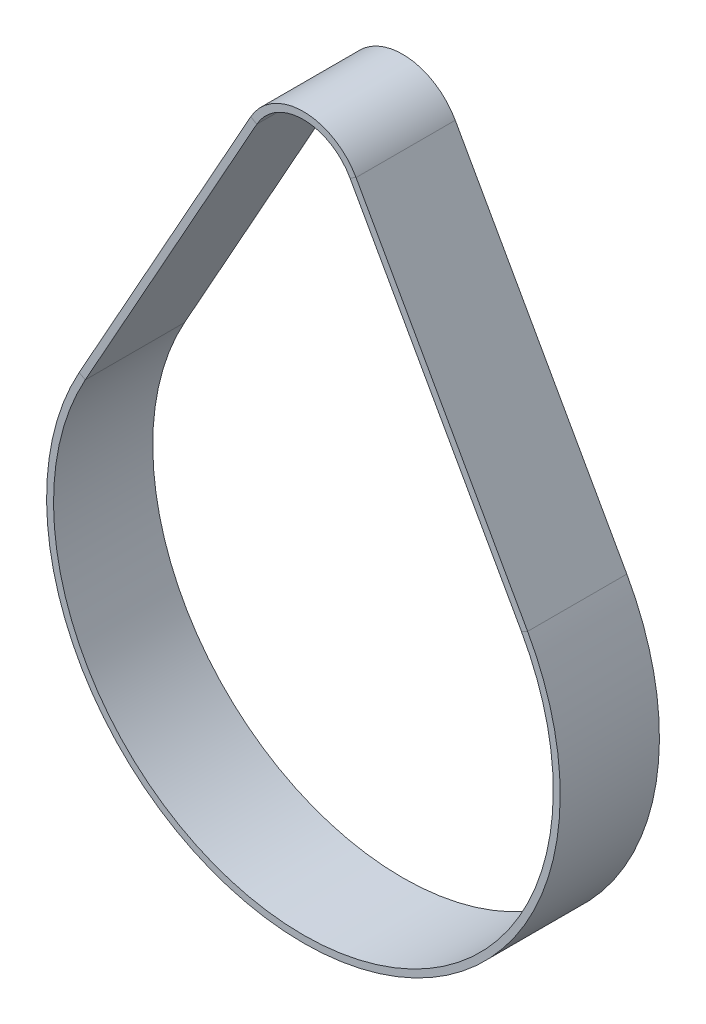
ISO-10303-21;
HEADER;
FILE_DESCRIPTION(('STEP AP214'),'2;1');
FILE_NAME('part.step','',(''),(''),'','','');
FILE_SCHEMA(('AUTOMOTIVE_DESIGN { 1 0 10303 214 1 1 1 1 }'));
ENDSEC;
DATA;
#1=APPLICATION_CONTEXT('core data for automotive mechanical design processes');
#2=APPLICATION_PROTOCOL_DEFINITION('international standard','automotive_design',2000,#1);
#3=PRODUCT_CONTEXT('',#1,'mechanical');
#4=PRODUCT('Part','Part','',(#3));
#5=PRODUCT_RELATED_PRODUCT_CATEGORY('part','',(#4));
#6=PRODUCT_DEFINITION_FORMATION('','',#4);
#7=PRODUCT_DEFINITION_CONTEXT('part definition',#1,'design');
#8=PRODUCT_DEFINITION('design','',#6,#7);
#9=PRODUCT_DEFINITION_SHAPE('','',#8);
#10=(LENGTH_UNIT() NAMED_UNIT(*) SI_UNIT(.MILLI.,.METRE.));
#11=(NAMED_UNIT(*) PLANE_ANGLE_UNIT() SI_UNIT($,.RADIAN.));
#12=(NAMED_UNIT(*) SI_UNIT($,.STERADIAN.) SOLID_ANGLE_UNIT());
#13=UNCERTAINTY_MEASURE_WITH_UNIT(LENGTH_MEASURE(1.E-05),#10,'distance_accuracy_value','');
#14=(GEOMETRIC_REPRESENTATION_CONTEXT(3) GLOBAL_UNCERTAINTY_ASSIGNED_CONTEXT((#13)) GLOBAL_UNIT_ASSIGNED_CONTEXT((#10,
#11,#12)) REPRESENTATION_CONTEXT('',''));
#15=CARTESIAN_POINT('',(0.,0.,0.));
#16=DIRECTION('',(0.,0.,1.));
#17=DIRECTION('',(1.,0.,0.));
#18=AXIS2_PLACEMENT_3D('',#15,#16,#17);
#19=CARTESIAN_POINT('',(0.,0.,0.));
#20=DIRECTION('',(0.,0.,1.));
#21=DIRECTION('',(1.,0.,0.));
#22=AXIS2_PLACEMENT_3D('',#19,#20,#21);
#23=CYLINDRICAL_SURFACE('',#22,22.66431181);
#24=DIRECTION('',(0.,0.,1.));
#25=VECTOR('',#24,1.);
#26=CARTESIAN_POINT('',(19.7879168947119,11.0503110720414,-4.5));
#27=LINE('',#26,#25);
#28=CARTESIAN_POINT('',(19.7879168947119,11.0503110720414,-4.5));
#29=VERTEX_POINT('',#28);
#30=CARTESIAN_POINT('',(19.7879168947119,11.0503110720414,4.5));
#31=VERTEX_POINT('',#30);
#32=EDGE_CURVE('E135',#29,#31,#27,.T.);
#33=ORIENTED_EDGE('',*,*,#32,.F.);
#34=CARTESIAN_POINT('',(0.,0.,-4.5));
#35=DIRECTION('',(0.,0.,1.));
#36=DIRECTION('',(-0.873087039244713,0.487564377188184,0.));
#37=AXIS2_PLACEMENT_3D('',#34,#35,#36);
#38=CIRCLE('',#37,22.66431181);
#39=CARTESIAN_POINT('',(-19.7879168947119,11.0503110720415,-4.5));
#40=VERTEX_POINT('',#39);
#41=EDGE_CURVE('E11',#40,#29,#38,.T.);
#42=ORIENTED_EDGE('',*,*,#41,.F.);
#43=DIRECTION('',(0.,0.,1.));
#44=VECTOR('',#43,1.);
#45=CARTESIAN_POINT('',(-19.7879168947119,11.0503110720414,-4.5));
#46=LINE('',#45,#44);
#47=CARTESIAN_POINT('',(-19.7879168947119,11.0503110720415,4.5));
#48=VERTEX_POINT('',#47);
#49=EDGE_CURVE('E46',#40,#48,#46,.T.);
#50=ORIENTED_EDGE('',*,*,#49,.T.);
#51=CARTESIAN_POINT('',(0.,0.,4.5));
#52=DIRECTION('',(0.,0.,1.));
#53=DIRECTION('',(-0.873087039244713,0.487564377188184,0.));
#54=AXIS2_PLACEMENT_3D('',#51,#52,#53);
#55=CIRCLE('',#54,22.66431181);
#56=EDGE_CURVE('E132',#48,#31,#55,.T.);
#57=ORIENTED_EDGE('',*,*,#56,.T.);
#58=EDGE_LOOP('',(#33,#42,#50,#57));
#59=FACE_BOUND('',#58,.T.);
#60=ADVANCED_FACE('F43',(#59),#23,.F.);
#61=CARTESIAN_POINT('',(-19.7879168947119,11.0503110720414,-4.5));
#62=DIRECTION('',(0.,0.,-1.));
#63=DIRECTION('',(-1.,0.,0.));
#64=AXIS2_PLACEMENT_3D('',#61,#62,#63);
#65=PLANE('',#64);
#66=DIRECTION('',(-0.873087039244713,-0.487564377188183,0.));
#67=VECTOR('',#66,1.);
#68=CARTESIAN_POINT('',(19.7879168947119,11.0503110720414,-4.5));
#69=LINE('',#68,#67);
#70=CARTESIAN_POINT('',(20.337961729436,11.35747662967,-4.5));
#71=VERTEX_POINT('',#70);
#72=EDGE_CURVE('E163',#71,#29,#69,.T.);
#73=ORIENTED_EDGE('',*,*,#72,.F.);
#74=CARTESIAN_POINT('',(0.,0.,-4.5));
#75=DIRECTION('',(0.,0.,1.));
#76=DIRECTION('',(-0.873087039244713,0.487564377188184,0.));
#77=AXIS2_PLACEMENT_3D('',#74,#75,#76);
#78=CIRCLE('',#77,23.29431181);
#79=CARTESIAN_POINT('',(-20.337961729436,11.35747662967,-4.5));
#80=VERTEX_POINT('',#79);
#81=EDGE_CURVE('E52',#80,#71,#78,.T.);
#82=ORIENTED_EDGE('',*,*,#81,.F.);
#83=DIRECTION('',(0.873087039244712,-0.487564377188185,0.));
#84=VECTOR('',#83,1.);
#85=CARTESIAN_POINT('',(-19.7879168947119,11.0503110720414,-4.5));
#86=LINE('',#85,#84);
#87=EDGE_CURVE('E223',#80,#40,#86,.T.);
#88=ORIENTED_EDGE('',*,*,#87,.T.);
#89=ORIENTED_EDGE('',*,*,#41,.T.);
#90=EDGE_LOOP('',(#73,#82,#88,#89));
#91=FACE_BOUND('',#90,.T.);
#92=ADVANCED_FACE('F258',(#91),#65,.T.);
#93=CARTESIAN_POINT('',(0.,0.,0.));
#94=DIRECTION('',(0.,0.,1.));
#95=DIRECTION('',(1.,0.,0.));
#96=AXIS2_PLACEMENT_3D('',#93,#94,#95);
#97=CYLINDRICAL_SURFACE('',#96,23.29431181);
#98=DIRECTION('',(0.,0.,-1.));
#99=VECTOR('',#98,1.);
#100=CARTESIAN_POINT('',(20.337961729436,11.35747662967,-4.5));
#101=LINE('',#100,#99);
#102=CARTESIAN_POINT('',(20.337961729436,11.35747662967,4.5));
#103=VERTEX_POINT('',#102);
#104=EDGE_CURVE('E168',#103,#71,#101,.T.);
#105=ORIENTED_EDGE('',*,*,#104,.F.);
#106=CARTESIAN_POINT('',(0.,0.,4.5));
#107=DIRECTION('',(0.,0.,1.));
#108=DIRECTION('',(-0.873087039244713,0.487564377188184,0.));
#109=AXIS2_PLACEMENT_3D('',#106,#107,#108);
#110=CIRCLE('',#109,23.29431181);
#111=CARTESIAN_POINT('',(-20.337961729436,11.35747662967,4.5));
#112=VERTEX_POINT('',#111);
#113=EDGE_CURVE('E142',#112,#103,#110,.T.);
#114=ORIENTED_EDGE('',*,*,#113,.F.);
#115=DIRECTION('',(0.,0.,-1.));
#116=VECTOR('',#115,1.);
#117=CARTESIAN_POINT('',(-20.337961729436,11.35747662967,-4.5));
#118=LINE('',#117,#116);
#119=EDGE_CURVE('E199',#112,#80,#118,.T.);
#120=ORIENTED_EDGE('',*,*,#119,.T.);
#121=ORIENTED_EDGE('',*,*,#81,.T.);
#122=EDGE_LOOP('',(#105,#114,#120,#121));
#123=FACE_BOUND('',#122,.T.);
#124=ADVANCED_FACE('F263',(#123),#97,.T.);
#125=CARTESIAN_POINT('',(-4.22483167040517,38.9193036312714,-4.5));
#126=DIRECTION('',(0.873087039244713,-0.487564377188184,0.));
#127=DIRECTION('',(0.487564377188184,0.873087039244713,0.));
#128=AXIS2_PLACEMENT_3D('',#125,#126,#127);
#129=PLANE('',#128);
#130=ORIENTED_EDGE('',*,*,#49,.F.);
#131=DIRECTION('',(-0.487564377188184,-0.873087039244713,0.));
#132=VECTOR('',#131,1.);
#133=CARTESIAN_POINT('',(-4.22483167040517,38.9193036312714,-4.5));
#134=LINE('',#133,#132);
#135=CARTESIAN_POINT('',(-4.22483167040518,38.9193036312714,-4.5));
#136=VERTEX_POINT('',#135);
#137=EDGE_CURVE('E88',#136,#40,#134,.T.);
#138=ORIENTED_EDGE('',*,*,#137,.F.);
#139=DIRECTION('',(0.,0.,1.));
#140=VECTOR('',#139,1.);
#141=CARTESIAN_POINT('',(-4.22483167040518,38.9193036312714,-4.5));
#142=LINE('',#141,#140);
#143=CARTESIAN_POINT('',(-4.22483167040518,38.9193036312714,4.5));
#144=VERTEX_POINT('',#143);
#145=EDGE_CURVE('E203',#136,#144,#142,.T.);
#146=ORIENTED_EDGE('',*,*,#145,.T.);
#147=DIRECTION('',(-0.487564377188184,-0.873087039244713,0.));
#148=VECTOR('',#147,1.);
#149=CARTESIAN_POINT('',(-4.22483167040517,38.9193036312714,4.5));
#150=LINE('',#149,#148);
#151=EDGE_CURVE('E196',#144,#48,#150,.T.);
#152=ORIENTED_EDGE('',*,*,#151,.T.);
#153=EDGE_LOOP('',(#130,#138,#146,#152));
#154=FACE_BOUND('',#153,.T.);
#155=ADVANCED_FACE('F247',(#154),#129,.T.);
#156=CARTESIAN_POINT('',(-4.22483167040517,38.9193036312714,-4.5));
#157=DIRECTION('',(0.,0.,-1.));
#158=DIRECTION('',(-1.,0.,0.));
#159=AXIS2_PLACEMENT_3D('',#156,#157,#158);
#160=PLANE('',#159);
#161=ORIENTED_EDGE('',*,*,#137,.T.);
#162=ORIENTED_EDGE('',*,*,#87,.F.);
#163=DIRECTION('',(-0.487564377188184,-0.873087039244713,0.));
#164=VECTOR('',#163,1.);
#165=CARTESIAN_POINT('',(-4.77487650512934,39.2264691888999,-4.5));
#166=LINE('',#165,#164);
#167=CARTESIAN_POINT('',(-4.77487650512935,39.2264691888999,-4.5));
#168=VERTEX_POINT('',#167);
#169=EDGE_CURVE('E97',#168,#80,#166,.T.);
#170=ORIENTED_EDGE('',*,*,#169,.F.);
#171=DIRECTION('',(0.873087039244712,-0.487564377188184,0.));
#172=VECTOR('',#171,1.);
#173=CARTESIAN_POINT('',(-4.22483167040518,38.9193036312714,-4.5));
#174=LINE('',#173,#172);
#175=EDGE_CURVE('E217',#168,#136,#174,.T.);
#176=ORIENTED_EDGE('',*,*,#175,.T.);
#177=EDGE_LOOP('',(#161,#162,#170,#176));
#178=FACE_BOUND('',#177,.T.);
#179=ADVANCED_FACE('F257',(#178),#160,.T.);
#180=CARTESIAN_POINT('',(-4.77487650512934,39.2264691888999,-4.5));
#181=DIRECTION('',(-0.873087039244713,0.487564377188184,0.));
#182=DIRECTION('',(-0.487564377188184,-0.873087039244713,0.));
#183=AXIS2_PLACEMENT_3D('',#180,#181,#182);
#184=PLANE('',#183);
#185=ORIENTED_EDGE('',*,*,#169,.T.);
#186=ORIENTED_EDGE('',*,*,#119,.F.);
#187=DIRECTION('',(-0.487564377188184,-0.873087039244713,0.));
#188=VECTOR('',#187,1.);
#189=CARTESIAN_POINT('',(-4.77487650512934,39.2264691888999,4.5));
#190=LINE('',#189,#188);
#191=CARTESIAN_POINT('',(-4.77487650512935,39.2264691888999,4.5));
#192=VERTEX_POINT('',#191);
#193=EDGE_CURVE('E105',#192,#112,#190,.T.);
#194=ORIENTED_EDGE('',*,*,#193,.F.);
#195=DIRECTION('',(0.,0.,-1.));
#196=VECTOR('',#195,1.);
#197=CARTESIAN_POINT('',(-4.77487650512935,39.2264691888999,-4.5));
#198=LINE('',#197,#196);
#199=EDGE_CURVE('E188',#192,#168,#198,.T.);
#200=ORIENTED_EDGE('',*,*,#199,.T.);
#201=EDGE_LOOP('',(#185,#186,#194,#200));
#202=FACE_BOUND('',#201,.T.);
#203=ADVANCED_FACE('F264',(#202),#184,.T.);
#204=CARTESIAN_POINT('',(-4.22483167040517,38.9193036312714,4.5));
#205=DIRECTION('',(0.,0.,1.));
#206=DIRECTION('',(1.,0.,0.));
#207=AXIS2_PLACEMENT_3D('',#204,#205,#206);
#208=PLANE('',#207);
#209=ORIENTED_EDGE('',*,*,#193,.T.);
#210=DIRECTION('',(-0.873087039244712,0.487564377188185,0.));
#211=VECTOR('',#210,1.);
#212=CARTESIAN_POINT('',(-19.7879168947119,11.0503110720414,4.5));
#213=LINE('',#212,#211);
#214=EDGE_CURVE('E193',#48,#112,#213,.T.);
#215=ORIENTED_EDGE('',*,*,#214,.F.);
#216=ORIENTED_EDGE('',*,*,#151,.F.);
#217=DIRECTION('',(-0.873087039244712,0.487564377188184,0.));
#218=VECTOR('',#217,1.);
#219=CARTESIAN_POINT('',(-4.22483167040518,38.9193036312714,4.5));
#220=LINE('',#219,#218);
#221=EDGE_CURVE('E181',#144,#192,#220,.T.);
#222=ORIENTED_EDGE('',*,*,#221,.T.);
#223=EDGE_LOOP('',(#209,#215,#216,#222));
#224=FACE_BOUND('',#223,.T.);
#225=ADVANCED_FACE('F265',(#224),#208,.T.);
#226=CARTESIAN_POINT('',(0.,36.56,0.));
#227=DIRECTION('',(0.,0.,1.));
#228=DIRECTION('',(1.,0.,0.));
#229=AXIS2_PLACEMENT_3D('',#226,#227,#228);
#230=CYLINDRICAL_SURFACE('',#229,4.83895817999999);
#231=ORIENTED_EDGE('',*,*,#145,.F.);
#232=CARTESIAN_POINT('',(0.,36.56,-4.5));
#233=DIRECTION('',(0.,0.,1.));
#234=DIRECTION('',(0.873087039244714,0.487564377188182,0.));
#235=AXIS2_PLACEMENT_3D('',#232,#233,#234);
#236=CIRCLE('',#235,4.83895817999999);
#237=CARTESIAN_POINT('',(4.22483167040518,38.9193036312714,-4.5));
#238=VERTEX_POINT('',#237);
#239=EDGE_CURVE('E234',#238,#136,#236,.T.);
#240=ORIENTED_EDGE('',*,*,#239,.F.);
#241=DIRECTION('',(0.,0.,1.));
#242=VECTOR('',#241,1.);
#243=CARTESIAN_POINT('',(4.22483167040518,38.9193036312714,-4.5));
#244=LINE('',#243,#242);
#245=CARTESIAN_POINT('',(4.22483167040518,38.9193036312714,4.5));
#246=VERTEX_POINT('',#245);
#247=EDGE_CURVE('E192',#238,#246,#244,.T.);
#248=ORIENTED_EDGE('',*,*,#247,.T.);
#249=CARTESIAN_POINT('',(0.,36.56,4.5));
#250=DIRECTION('',(0.,0.,1.));
#251=DIRECTION('',(0.873087039244714,0.487564377188182,0.));
#252=AXIS2_PLACEMENT_3D('',#249,#250,#251);
#253=CIRCLE('',#252,4.83895817999999);
#254=EDGE_CURVE('E185',#246,#144,#253,.T.);
#255=ORIENTED_EDGE('',*,*,#254,.T.);
#256=EDGE_LOOP('',(#231,#240,#248,#255));
#257=FACE_BOUND('',#256,.T.);
#258=ADVANCED_FACE('F252',(#257),#230,.F.);
#259=CARTESIAN_POINT('',(4.22483167040518,38.9193036312714,-4.5));
#260=DIRECTION('',(0.,0.,-1.));
#261=DIRECTION('',(-1.,0.,0.));
#262=AXIS2_PLACEMENT_3D('',#259,#260,#261);
#263=PLANE('',#262);
#264=ORIENTED_EDGE('',*,*,#239,.T.);
#265=ORIENTED_EDGE('',*,*,#175,.F.);
#266=CARTESIAN_POINT('',(0.,36.56,-4.5));
#267=DIRECTION('',(0.,0.,1.));
#268=DIRECTION('',(0.873087039244713,0.487564377188183,0.));
#269=AXIS2_PLACEMENT_3D('',#266,#267,#268);
#270=CIRCLE('',#269,5.46895817999999);
#271=CARTESIAN_POINT('',(4.77487650512935,39.2264691888999,-4.5));
#272=VERTEX_POINT('',#271);
#273=EDGE_CURVE('E117',#272,#168,#270,.T.);
#274=ORIENTED_EDGE('',*,*,#273,.F.);
#275=DIRECTION('',(-0.873087039244713,-0.487564377188183,0.));
#276=VECTOR('',#275,1.);
#277=CARTESIAN_POINT('',(4.22483167040518,38.9193036312714,-4.5));
#278=LINE('',#277,#276);
#279=EDGE_CURVE('E212',#272,#238,#278,.T.);
#280=ORIENTED_EDGE('',*,*,#279,.T.);
#281=EDGE_LOOP('',(#264,#265,#274,#280));
#282=FACE_BOUND('',#281,.T.);
#283=ADVANCED_FACE('F256',(#282),#263,.T.);
#284=CARTESIAN_POINT('',(0.,36.56,0.));
#285=DIRECTION('',(0.,0.,1.));
#286=DIRECTION('',(1.,0.,0.));
#287=AXIS2_PLACEMENT_3D('',#284,#285,#286);
#288=CYLINDRICAL_SURFACE('',#287,5.46895817999999);
#289=ORIENTED_EDGE('',*,*,#273,.T.);
#290=ORIENTED_EDGE('',*,*,#199,.F.);
#291=CARTESIAN_POINT('',(0.,36.56,4.5));
#292=DIRECTION('',(0.,0.,1.));
#293=DIRECTION('',(0.873087039244713,0.487564377188183,0.));
#294=AXIS2_PLACEMENT_3D('',#291,#292,#293);
#295=CIRCLE('',#294,5.46895817999999);
#296=CARTESIAN_POINT('',(4.77487650512935,39.2264691888999,4.5));
#297=VERTEX_POINT('',#296);
#298=EDGE_CURVE('E123',#297,#192,#295,.T.);
#299=ORIENTED_EDGE('',*,*,#298,.F.);
#300=DIRECTION('',(0.,0.,-1.));
#301=VECTOR('',#300,1.);
#302=CARTESIAN_POINT('',(4.77487650512935,39.2264691888999,-4.5));
#303=LINE('',#302,#301);
#304=EDGE_CURVE('E179',#297,#272,#303,.T.);
#305=ORIENTED_EDGE('',*,*,#304,.T.);
#306=EDGE_LOOP('',(#289,#290,#299,#305));
#307=FACE_BOUND('',#306,.T.);
#308=ADVANCED_FACE('F320',(#307),#288,.T.);
#309=CARTESIAN_POINT('',(4.22483167040518,38.9193036312714,4.5));
#310=DIRECTION('',(0.,0.,1.));
#311=DIRECTION('',(1.,0.,0.));
#312=AXIS2_PLACEMENT_3D('',#309,#310,#311);
#313=PLANE('',#312);
#314=ORIENTED_EDGE('',*,*,#298,.T.);
#315=ORIENTED_EDGE('',*,*,#221,.F.);
#316=ORIENTED_EDGE('',*,*,#254,.F.);
#317=DIRECTION('',(0.873087039244713,0.487564377188183,0.));
#318=VECTOR('',#317,1.);
#319=CARTESIAN_POINT('',(4.22483167040518,38.9193036312714,4.5));
#320=LINE('',#319,#318);
#321=EDGE_CURVE('E153',#246,#297,#320,.T.);
#322=ORIENTED_EDGE('',*,*,#321,.T.);
#323=EDGE_LOOP('',(#314,#315,#316,#322));
#324=FACE_BOUND('',#323,.T.);
#325=ADVANCED_FACE('F250',(#324),#313,.T.);
#326=CARTESIAN_POINT('',(19.7879168947119,11.0503110720414,-4.5));
#327=DIRECTION('',(-0.873087039244713,-0.487564377188184,0.));
#328=DIRECTION('',(0.487564377188184,-0.873087039244713,0.));
#329=AXIS2_PLACEMENT_3D('',#326,#327,#328);
#330=PLANE('',#329);
#331=ORIENTED_EDGE('',*,*,#247,.F.);
#332=DIRECTION('',(-0.487564377188184,0.873087039244713,0.));
#333=VECTOR('',#332,1.);
#334=CARTESIAN_POINT('',(19.7879168947119,11.0503110720414,-4.5));
#335=LINE('',#334,#333);
#336=EDGE_CURVE('E161',#29,#238,#335,.T.);
#337=ORIENTED_EDGE('',*,*,#336,.F.);
#338=ORIENTED_EDGE('',*,*,#32,.T.);
#339=DIRECTION('',(-0.487564377188184,0.873087039244713,0.));
#340=VECTOR('',#339,1.);
#341=CARTESIAN_POINT('',(19.7879168947119,11.0503110720414,4.5));
#342=LINE('',#341,#340);
#343=EDGE_CURVE('E148',#31,#246,#342,.T.);
#344=ORIENTED_EDGE('',*,*,#343,.T.);
#345=EDGE_LOOP('',(#331,#337,#338,#344));
#346=FACE_BOUND('',#345,.T.);
#347=ADVANCED_FACE('F159',(#346),#330,.T.);
#348=CARTESIAN_POINT('',(19.7879168947119,11.0503110720414,-4.5));
#349=DIRECTION('',(0.,0.,-1.));
#350=DIRECTION('',(-1.,0.,0.));
#351=AXIS2_PLACEMENT_3D('',#348,#349,#350);
#352=PLANE('',#351);
#353=ORIENTED_EDGE('',*,*,#336,.T.);
#354=ORIENTED_EDGE('',*,*,#279,.F.);
#355=DIRECTION('',(-0.487564377188184,0.873087039244713,0.));
#356=VECTOR('',#355,1.);
#357=CARTESIAN_POINT('',(20.337961729436,11.35747662967,-4.5));
#358=LINE('',#357,#356);
#359=EDGE_CURVE('E208',#71,#272,#358,.T.);
#360=ORIENTED_EDGE('',*,*,#359,.F.);
#361=ORIENTED_EDGE('',*,*,#72,.T.);
#362=EDGE_LOOP('',(#353,#354,#360,#361));
#363=FACE_BOUND('',#362,.T.);
#364=ADVANCED_FACE('F254',(#363),#352,.T.);
#365=CARTESIAN_POINT('',(20.337961729436,11.35747662967,-4.5));
#366=DIRECTION('',(0.873087039244713,0.487564377188184,0.));
#367=DIRECTION('',(-0.487564377188184,0.873087039244713,0.));
#368=AXIS2_PLACEMENT_3D('',#365,#366,#367);
#369=PLANE('',#368);
#370=ORIENTED_EDGE('',*,*,#359,.T.);
#371=ORIENTED_EDGE('',*,*,#304,.F.);
#372=DIRECTION('',(-0.487564377188184,0.873087039244713,0.));
#373=VECTOR('',#372,1.);
#374=CARTESIAN_POINT('',(20.337961729436,11.35747662967,4.5));
#375=LINE('',#374,#373);
#376=EDGE_CURVE('E177',#103,#297,#375,.T.);
#377=ORIENTED_EDGE('',*,*,#376,.F.);
#378=ORIENTED_EDGE('',*,*,#104,.T.);
#379=EDGE_LOOP('',(#370,#371,#377,#378));
#380=FACE_BOUND('',#379,.T.);
#381=ADVANCED_FACE('F261',(#380),#369,.T.);
#382=CARTESIAN_POINT('',(19.7879168947119,11.0503110720414,4.5));
#383=DIRECTION('',(0.,0.,1.));
#384=DIRECTION('',(1.,0.,0.));
#385=AXIS2_PLACEMENT_3D('',#382,#383,#384);
#386=PLANE('',#385);
#387=ORIENTED_EDGE('',*,*,#376,.T.);
#388=ORIENTED_EDGE('',*,*,#321,.F.);
#389=ORIENTED_EDGE('',*,*,#343,.F.);
#390=DIRECTION('',(0.873087039244713,0.487564377188183,0.));
#391=VECTOR('',#390,1.);
#392=CARTESIAN_POINT('',(19.7879168947119,11.0503110720414,4.5));
#393=LINE('',#392,#391);
#394=EDGE_CURVE('E151',#31,#103,#393,.T.);
#395=ORIENTED_EDGE('',*,*,#394,.T.);
#396=EDGE_LOOP('',(#387,#388,#389,#395));
#397=FACE_BOUND('',#396,.T.);
#398=ADVANCED_FACE('F150',(#397),#386,.T.);
#399=CARTESIAN_POINT('',(-19.7879168947119,11.0503110720414,4.5));
#400=DIRECTION('',(0.,0.,1.));
#401=DIRECTION('',(1.,0.,0.));
#402=AXIS2_PLACEMENT_3D('',#399,#400,#401);
#403=PLANE('',#402);
#404=ORIENTED_EDGE('',*,*,#394,.F.);
#405=ORIENTED_EDGE('',*,*,#56,.F.);
#406=ORIENTED_EDGE('',*,*,#214,.T.);
#407=ORIENTED_EDGE('',*,*,#113,.T.);
#408=EDGE_LOOP('',(#404,#405,#406,#407));
#409=FACE_BOUND('',#408,.T.);
#410=ADVANCED_FACE('F165',(#409),#403,.T.);
#411=CLOSED_SHELL('',(#60,#92,#124,#155,#179,#203,#225,#258,#283,#308,#325,#347,#364,#381,#398,#410));
#412=MANIFOLD_SOLID_BREP('B2',#411);
#413=ADVANCED_BREP_SHAPE_REPRESENTATION('',(#18,#412),#14);
#414=SHAPE_DEFINITION_REPRESENTATION(#9,#413);
ENDSEC;
END-ISO-10303-21;
